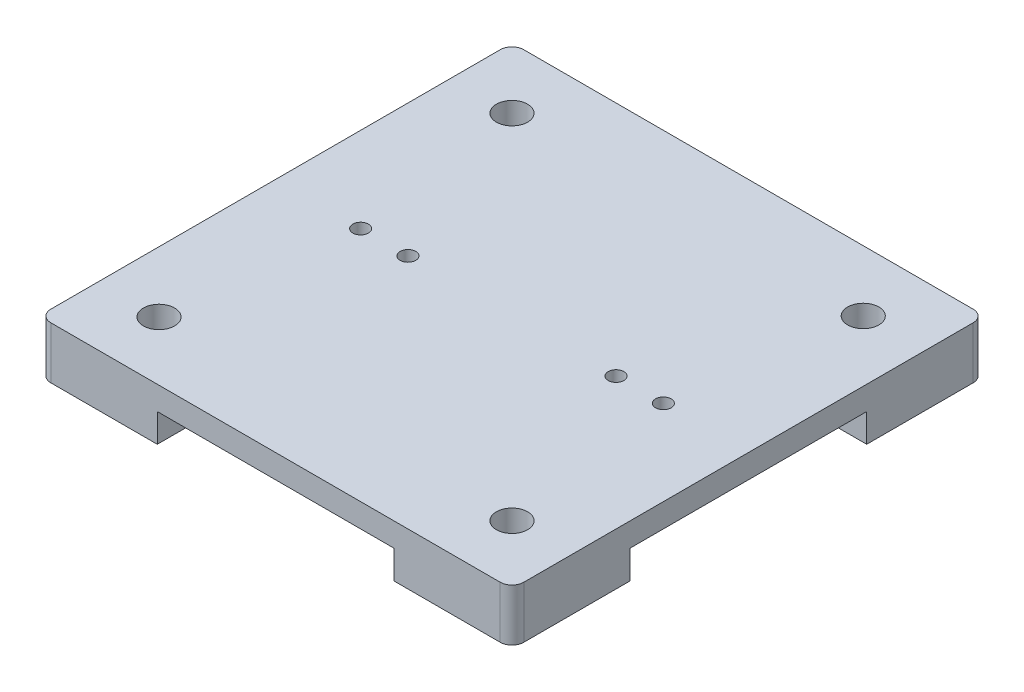
ISO-10303-21;
HEADER;
FILE_DESCRIPTION(('STEP AP214'),'2;1');
FILE_NAME('part.step','',(''),(''),'','','');
FILE_SCHEMA(('AUTOMOTIVE_DESIGN { 1 0 10303 214 1 1 1 1 }'));
ENDSEC;
DATA;
#1=APPLICATION_CONTEXT('core data for automotive mechanical design processes');
#2=APPLICATION_PROTOCOL_DEFINITION('international standard','automotive_design',2000,#1);
#3=PRODUCT_CONTEXT('',#1,'mechanical');
#4=PRODUCT('Part','Part','',(#3));
#5=PRODUCT_RELATED_PRODUCT_CATEGORY('part','',(#4));
#6=PRODUCT_DEFINITION_FORMATION('','',#4);
#7=PRODUCT_DEFINITION_CONTEXT('part definition',#1,'design');
#8=PRODUCT_DEFINITION('design','',#6,#7);
#9=PRODUCT_DEFINITION_SHAPE('','',#8);
#10=(LENGTH_UNIT() NAMED_UNIT(*) SI_UNIT(.MILLI.,.METRE.));
#11=(NAMED_UNIT(*) PLANE_ANGLE_UNIT() SI_UNIT($,.RADIAN.));
#12=(NAMED_UNIT(*) SI_UNIT($,.STERADIAN.) SOLID_ANGLE_UNIT());
#13=UNCERTAINTY_MEASURE_WITH_UNIT(LENGTH_MEASURE(1.E-05),#10,'distance_accuracy_value','');
#14=(GEOMETRIC_REPRESENTATION_CONTEXT(3) GLOBAL_UNCERTAINTY_ASSIGNED_CONTEXT((#13)) GLOBAL_UNIT_ASSIGNED_CONTEXT((#10,
#11,#12)) REPRESENTATION_CONTEXT('',''));
#15=CARTESIAN_POINT('',(0.,0.,0.));
#16=DIRECTION('',(0.,0.,1.));
#17=DIRECTION('',(1.,0.,0.));
#18=AXIS2_PLACEMENT_3D('',#15,#16,#17);
#19=CARTESIAN_POINT('',(-47.5,-6.00000000000001,47.5000000000001));
#20=DIRECTION('',(0.,-1.,0.));
#21=DIRECTION('',(0.,0.,-1.));
#22=AXIS2_PLACEMENT_3D('',#19,#20,#21);
#23=PLANE('',#22);
#24=CARTESIAN_POINT('',(-47.5,-6.00000000000001,47.5000000000001));
#25=DIRECTION('',(0.,-1.,0.));
#26=DIRECTION('',(0.,0.,-1.));
#27=AXIS2_PLACEMENT_3D('',#24,#25,#26);
#28=CIRCLE('',#27,2.5);
#29=CARTESIAN_POINT('',(-47.5,-6.00000000000001,50.));
#30=VERTEX_POINT('',#29);
#31=CARTESIAN_POINT('',(-50.,-6.00000000000001,47.4999999999999));
#32=VERTEX_POINT('',#31);
#33=EDGE_CURVE('E268',#30,#32,#28,.T.);
#34=ORIENTED_EDGE('',*,*,#33,.T.);
#35=DIRECTION('',(0.,0.,-1.));
#36=VECTOR('',#35,1.);
#37=CARTESIAN_POINT('',(-50.,-5.99999999999978,24.9999999999999));
#38=LINE('',#37,#36);
#39=CARTESIAN_POINT('',(-50.,-5.99999999999978,24.9999999999999));
#40=VERTEX_POINT('',#39);
#41=EDGE_CURVE('E271',#32,#40,#38,.T.);
#42=ORIENTED_EDGE('',*,*,#41,.T.);
#43=DIRECTION('',(1.,0.,0.));
#44=VECTOR('',#43,1.);
#45=CARTESIAN_POINT('',(-25.,-5.99999999999978,24.9999999999999));
#46=LINE('',#45,#44);
#47=CARTESIAN_POINT('',(-25.,-5.99999999999978,24.9999999999999));
#48=VERTEX_POINT('',#47);
#49=EDGE_CURVE('E274',#40,#48,#46,.T.);
#50=ORIENTED_EDGE('',*,*,#49,.T.);
#51=DIRECTION('',(0.,0.,1.));
#52=VECTOR('',#51,1.);
#53=CARTESIAN_POINT('',(-25.,-5.99999999999978,24.9999999999999));
#54=LINE('',#53,#52);
#55=CARTESIAN_POINT('',(-25.0000000000001,-5.99999999999989,50.0000000000003));
#56=VERTEX_POINT('',#55);
#57=EDGE_CURVE('E276',#48,#56,#54,.T.);
#58=ORIENTED_EDGE('',*,*,#57,.T.);
#59=DIRECTION('',(-1.,0.,0.));
#60=VECTOR('',#59,1.);
#61=CARTESIAN_POINT('',(-25.0000000000001,-5.99999999999989,50.0000000000003));
#62=LINE('',#61,#60);
#63=EDGE_CURVE('E278',#56,#30,#62,.T.);
#64=ORIENTED_EDGE('',*,*,#63,.T.);
#65=EDGE_LOOP('',(#34,#42,#50,#58,#64));
#66=FACE_BOUND('',#65,.T.);
#67=CARTESIAN_POINT('',(-37.1338834764834,-5.99999999999978,37.5000000000001));
#68=DIRECTION('',(0.,1.,0.));
#69=DIRECTION('',(0.,0.,1.));
#70=AXIS2_PLACEMENT_3D('',#67,#68,#69);
#71=CIRCLE('',#70,3.29999999999999);
#72=CARTESIAN_POINT('',(-37.1338834764834,-5.99999999999978,40.8000000000001));
#73=VERTEX_POINT('',#72);
#74=EDGE_CURVE('E657',#73,#73,#71,.T.);
#75=ORIENTED_EDGE('',*,*,#74,.T.);
#76=EDGE_LOOP('',(#75));
#77=FACE_BOUND('',#76,.T.);
#78=ADVANCED_FACE('F41',(#66,#77),#23,.T.);
#79=CARTESIAN_POINT('',(-47.5,0.,47.5000000000001));
#80=DIRECTION('',(0.,1.,0.));
#81=DIRECTION('',(0.,0.,1.));
#82=AXIS2_PLACEMENT_3D('',#79,#80,#81);
#83=PLANE('',#82);
#84=CARTESIAN_POINT('',(-32.,0.,0.));
#85=DIRECTION('',(0.,1.,0.));
#86=DIRECTION('',(0.,0.,1.));
#87=AXIS2_PLACEMENT_3D('',#84,#85,#86);
#88=CIRCLE('',#87,1.65);
#89=CARTESIAN_POINT('',(-32.,0.,1.65));
#90=VERTEX_POINT('',#89);
#91=EDGE_CURVE('E669',#90,#90,#88,.T.);
#92=ORIENTED_EDGE('',*,*,#91,.T.);
#93=EDGE_LOOP('',(#92));
#94=FACE_BOUND('',#93,.T.);
#95=CARTESIAN_POINT('',(-22.,1.11022302462516E-13,0.));
#96=DIRECTION('',(0.,1.,0.));
#97=DIRECTION('',(0.,0.,1.));
#98=AXIS2_PLACEMENT_3D('',#95,#96,#97);
#99=CIRCLE('',#98,1.65);
#100=CARTESIAN_POINT('',(-22.,1.11022302462516E-13,1.65));
#101=VERTEX_POINT('',#100);
#102=EDGE_CURVE('E672',#101,#101,#99,.T.);
#103=ORIENTED_EDGE('',*,*,#102,.T.);
#104=EDGE_LOOP('',(#103));
#105=FACE_BOUND('',#104,.T.);
#106=CARTESIAN_POINT('',(22.,0.,0.));
#107=DIRECTION('',(0.,1.,0.));
#108=DIRECTION('',(0.,0.,1.));
#109=AXIS2_PLACEMENT_3D('',#106,#107,#108);
#110=CIRCLE('',#109,1.65);
#111=CARTESIAN_POINT('',(22.,0.,1.65));
#112=VERTEX_POINT('',#111);
#113=EDGE_CURVE('E678',#112,#112,#110,.T.);
#114=ORIENTED_EDGE('',*,*,#113,.T.);
#115=EDGE_LOOP('',(#114));
#116=FACE_BOUND('',#115,.T.);
#117=CARTESIAN_POINT('',(32.,0.,0.));
#118=DIRECTION('',(0.,1.,0.));
#119=DIRECTION('',(0.,0.,1.));
#120=AXIS2_PLACEMENT_3D('',#117,#118,#119);
#121=CIRCLE('',#120,1.65);
#122=CARTESIAN_POINT('',(32.,0.,1.65));
#123=VERTEX_POINT('',#122);
#124=EDGE_CURVE('E684',#123,#123,#121,.T.);
#125=ORIENTED_EDGE('',*,*,#124,.T.);
#126=EDGE_LOOP('',(#125));
#127=FACE_BOUND('',#126,.T.);
#128=DIRECTION('',(1.,0.,0.));
#129=VECTOR('',#128,1.);
#130=CARTESIAN_POINT('',(25.,1.11022302462516E-13,24.9999999999999));
#131=LINE('',#130,#129);
#132=CARTESIAN_POINT('',(25.,1.11022302462516E-13,24.9999999999999));
#133=VERTEX_POINT('',#132);
#134=CARTESIAN_POINT('',(50.,2.22044604925031E-13,24.9999999999999));
#135=VERTEX_POINT('',#134);
#136=EDGE_CURVE('E253',#133,#135,#131,.T.);
#137=ORIENTED_EDGE('',*,*,#136,.F.);
#138=DIRECTION('',(0.,0.,-1.));
#139=VECTOR('',#138,1.);
#140=CARTESIAN_POINT('',(25.,1.11022302462516E-13,24.9999999999999));
#141=LINE('',#140,#139);
#142=CARTESIAN_POINT('',(25.,0.,50.0000000000003));
#143=VERTEX_POINT('',#142);
#144=EDGE_CURVE('E56',#143,#133,#141,.T.);
#145=ORIENTED_EDGE('',*,*,#144,.F.);
#146=DIRECTION('',(1.,0.,0.));
#147=VECTOR('',#146,1.);
#148=CARTESIAN_POINT('',(-47.5,0.,50.));
#149=LINE('',#148,#147);
#150=CARTESIAN_POINT('',(-25.,1.11022302462516E-13,50.0000000000003));
#151=VERTEX_POINT('',#150);
#152=EDGE_CURVE('E60',#151,#143,#149,.T.);
#153=ORIENTED_EDGE('',*,*,#152,.F.);
#154=DIRECTION('',(0.,0.,1.));
#155=VECTOR('',#154,1.);
#156=CARTESIAN_POINT('',(-25.,2.22044604925031E-13,24.9999999999999));
#157=LINE('',#156,#155);
#158=CARTESIAN_POINT('',(-25.,2.22044604925031E-13,24.9999999999999));
#159=VERTEX_POINT('',#158);
#160=EDGE_CURVE('E272',#159,#151,#157,.T.);
#161=ORIENTED_EDGE('',*,*,#160,.F.);
#162=DIRECTION('',(1.,0.,0.));
#163=VECTOR('',#162,1.);
#164=CARTESIAN_POINT('',(-25.,2.22044604925031E-13,24.9999999999999));
#165=LINE('',#164,#163);
#166=CARTESIAN_POINT('',(-50.,2.22044604925031E-13,24.9999999999999));
#167=VERTEX_POINT('',#166);
#168=EDGE_CURVE('E195',#167,#159,#165,.T.);
#169=ORIENTED_EDGE('',*,*,#168,.F.);
#170=DIRECTION('',(0.,0.,1.));
#171=VECTOR('',#170,1.);
#172=CARTESIAN_POINT('',(-50.,0.,-47.5000000000001));
#173=LINE('',#172,#171);
#174=CARTESIAN_POINT('',(-49.9999999999998,0.,-24.9999999999999));
#175=VERTEX_POINT('',#174);
#176=EDGE_CURVE('E179',#175,#167,#173,.T.);
#177=ORIENTED_EDGE('',*,*,#176,.F.);
#178=DIRECTION('',(-1.,0.,0.));
#179=VECTOR('',#178,1.);
#180=CARTESIAN_POINT('',(-24.9999999999997,0.,-24.9999999999999));
#181=LINE('',#180,#179);
#182=CARTESIAN_POINT('',(-24.9999999999997,0.,-24.9999999999999));
#183=VERTEX_POINT('',#182);
#184=EDGE_CURVE('E173',#183,#175,#181,.T.);
#185=ORIENTED_EDGE('',*,*,#184,.F.);
#186=DIRECTION('',(0.,0.,1.));
#187=VECTOR('',#186,1.);
#188=CARTESIAN_POINT('',(-24.9999999999997,0.,-24.9999999999999));
#189=LINE('',#188,#187);
#190=CARTESIAN_POINT('',(-25.,2.22044604925031E-13,-50.));
#191=VERTEX_POINT('',#190);
#192=EDGE_CURVE('E176',#191,#183,#189,.T.);
#193=ORIENTED_EDGE('',*,*,#192,.F.);
#194=DIRECTION('',(1.,0.,0.));
#195=VECTOR('',#194,1.);
#196=CARTESIAN_POINT('',(-47.5,2.22044604925031E-13,-50.));
#197=LINE('',#196,#195);
#198=CARTESIAN_POINT('',(25.,1.11022302462516E-13,-50.));
#199=VERTEX_POINT('',#198);
#200=EDGE_CURVE('E297',#191,#199,#197,.T.);
#201=ORIENTED_EDGE('',*,*,#200,.T.);
#202=DIRECTION('',(0.,0.,-1.));
#203=VECTOR('',#202,1.);
#204=CARTESIAN_POINT('',(25.0000000000002,0.,-24.9999999999999));
#205=LINE('',#204,#203);
#206=CARTESIAN_POINT('',(25.0000000000002,0.,-24.9999999999999));
#207=VERTEX_POINT('',#206);
#208=EDGE_CURVE('E226',#207,#199,#205,.T.);
#209=ORIENTED_EDGE('',*,*,#208,.F.);
#210=DIRECTION('',(-1.,0.,0.));
#211=VECTOR('',#210,1.);
#212=CARTESIAN_POINT('',(25.0000000000002,0.,-24.9999999999999));
#213=LINE('',#212,#211);
#214=CARTESIAN_POINT('',(50.0000000000002,0.,-24.9999999999999));
#215=VERTEX_POINT('',#214);
#216=EDGE_CURVE('E203',#215,#207,#213,.T.);
#217=ORIENTED_EDGE('',*,*,#216,.F.);
#218=DIRECTION('',(0.,0.,1.));
#219=VECTOR('',#218,1.);
#220=CARTESIAN_POINT('',(50.,0.,-47.5000000000001));
#221=LINE('',#220,#219);
#222=EDGE_CURVE('E317',#215,#135,#221,.T.);
#223=ORIENTED_EDGE('',*,*,#222,.T.);
#224=EDGE_LOOP('',(#137,#145,#153,#161,#169,#177,#185,#193,#201,#209,#217,#223));
#225=FACE_BOUND('',#224,.T.);
#226=ADVANCED_FACE('F175',(#94,#105,#116,#127,#225),#83,.F.);
#227=CARTESIAN_POINT('',(-50.,5.,-47.5000000000001));
#228=DIRECTION('',(1.,0.,0.));
#229=DIRECTION('',(0.,0.,-1.));
#230=AXIS2_PLACEMENT_3D('',#227,#228,#229);
#231=PLANE('',#230);
#232=DIRECTION('',(0.,-1.,0.));
#233=VECTOR('',#232,1.);
#234=CARTESIAN_POINT('',(-50.,5.,-47.5000000000001));
#235=LINE('',#234,#233);
#236=CARTESIAN_POINT('',(-50.,5.,-47.5000000000001));
#237=VERTEX_POINT('',#236);
#238=CARTESIAN_POINT('',(-50.,-6.00000000000001,-47.5000000000001));
#239=VERTEX_POINT('',#238);
#240=EDGE_CURVE('E314',#237,#239,#235,.T.);
#241=ORIENTED_EDGE('',*,*,#240,.T.);
#242=DIRECTION('',(0.,0.,-1.));
#243=VECTOR('',#242,1.);
#244=CARTESIAN_POINT('',(-50.,-6.00000000000001,-24.9999999999999));
#245=LINE('',#244,#243);
#246=CARTESIAN_POINT('',(-50.,-6.00000000000001,-24.9999999999999));
#247=VERTEX_POINT('',#246);
#248=EDGE_CURVE('E201',#247,#239,#245,.T.);
#249=ORIENTED_EDGE('',*,*,#248,.F.);
#250=DIRECTION('',(0.,1.,0.));
#251=VECTOR('',#250,1.);
#252=CARTESIAN_POINT('',(-50.,-6.00000000000001,-24.9999999999999));
#253=LINE('',#252,#251);
#254=EDGE_CURVE('E199',#247,#175,#253,.T.);
#255=ORIENTED_EDGE('',*,*,#254,.T.);
#256=ORIENTED_EDGE('',*,*,#176,.T.);
#257=DIRECTION('',(0.,1.,0.));
#258=VECTOR('',#257,1.);
#259=CARTESIAN_POINT('',(-50.,-5.99999999999978,24.9999999999999));
#260=LINE('',#259,#258);
#261=EDGE_CURVE('E290',#40,#167,#260,.T.);
#262=ORIENTED_EDGE('',*,*,#261,.F.);
#263=ORIENTED_EDGE('',*,*,#41,.F.);
#264=DIRECTION('',(0.,-1.,0.));
#265=VECTOR('',#264,1.);
#266=CARTESIAN_POINT('',(-50.,5.,47.4999999999999));
#267=LINE('',#266,#265);
#268=CARTESIAN_POINT('',(-50.,5.,47.4999999999999));
#269=VERTEX_POINT('',#268);
#270=EDGE_CURVE('E11',#269,#32,#267,.T.);
#271=ORIENTED_EDGE('',*,*,#270,.F.);
#272=DIRECTION('',(0.,0.,1.));
#273=VECTOR('',#272,1.);
#274=CARTESIAN_POINT('',(-50.,5.,-47.5000000000001));
#275=LINE('',#274,#273);
#276=EDGE_CURVE('E293',#237,#269,#275,.T.);
#277=ORIENTED_EDGE('',*,*,#276,.F.);
#278=EDGE_LOOP('',(#241,#249,#255,#256,#262,#263,#271,#277));
#279=FACE_BOUND('',#278,.T.);
#280=ADVANCED_FACE('F43',(#279),#231,.F.);
#281=CARTESIAN_POINT('',(-47.4999999999999,5.,47.5000000000001));
#282=DIRECTION('',(0.,-1.,0.));
#283=DIRECTION('',(0.,0.,-1.));
#284=AXIS2_PLACEMENT_3D('',#281,#282,#283);
#285=CYLINDRICAL_SURFACE('',#284,2.5);
#286=ORIENTED_EDGE('',*,*,#270,.T.);
#287=ORIENTED_EDGE('',*,*,#33,.F.);
#288=DIRECTION('',(0.,-1.,0.));
#289=VECTOR('',#288,1.);
#290=CARTESIAN_POINT('',(-47.5,5.,50.));
#291=LINE('',#290,#289);
#292=CARTESIAN_POINT('',(-47.5,5.,50.));
#293=VERTEX_POINT('',#292);
#294=EDGE_CURVE('E49',#293,#30,#291,.T.);
#295=ORIENTED_EDGE('',*,*,#294,.F.);
#296=CARTESIAN_POINT('',(-47.4999999999999,5.,47.5000000000001));
#297=DIRECTION('',(0.,1.,0.));
#298=DIRECTION('',(0.,0.,1.));
#299=AXIS2_PLACEMENT_3D('',#296,#297,#298);
#300=CIRCLE('',#299,2.5);
#301=EDGE_CURVE('E296',#269,#293,#300,.T.);
#302=ORIENTED_EDGE('',*,*,#301,.F.);
#303=EDGE_LOOP('',(#286,#287,#295,#302));
#304=FACE_BOUND('',#303,.T.);
#305=ADVANCED_FACE('F342',(#304),#285,.T.);
#306=CARTESIAN_POINT('',(-47.5,5.,50.));
#307=DIRECTION('',(0.,0.,-1.));
#308=DIRECTION('',(-1.,0.,0.));
#309=AXIS2_PLACEMENT_3D('',#306,#307,#308);
#310=PLANE('',#309);
#311=ORIENTED_EDGE('',*,*,#294,.T.);
#312=ORIENTED_EDGE('',*,*,#63,.F.);
#313=DIRECTION('',(0.,1.,0.));
#314=VECTOR('',#313,1.);
#315=CARTESIAN_POINT('',(-25.0000000000001,-5.99999999999989,50.0000000000003));
#316=LINE('',#315,#314);
#317=EDGE_CURVE('E281',#56,#151,#316,.T.);
#318=ORIENTED_EDGE('',*,*,#317,.T.);
#319=ORIENTED_EDGE('',*,*,#152,.T.);
#320=DIRECTION('',(0.,1.,0.));
#321=VECTOR('',#320,1.);
#322=CARTESIAN_POINT('',(25.,-6.00000000000001,50.0000000000003));
#323=LINE('',#322,#321);
#324=CARTESIAN_POINT('',(25.,-6.00000000000001,50.0000000000003));
#325=VERTEX_POINT('',#324);
#326=EDGE_CURVE('E242',#325,#143,#323,.T.);
#327=ORIENTED_EDGE('',*,*,#326,.F.);
#328=DIRECTION('',(-1.,0.,0.));
#329=VECTOR('',#328,1.);
#330=CARTESIAN_POINT('',(25.,-6.00000000000001,50.0000000000003));
#331=LINE('',#330,#329);
#332=CARTESIAN_POINT('',(47.4999999999999,-6.00000000000001,50.0000000000003));
#333=VERTEX_POINT('',#332);
#334=EDGE_CURVE('E264',#333,#325,#331,.T.);
#335=ORIENTED_EDGE('',*,*,#334,.F.);
#336=DIRECTION('',(0.,-1.,0.));
#337=VECTOR('',#336,1.);
#338=CARTESIAN_POINT('',(47.5,5.,50.0000000000003));
#339=LINE('',#338,#337);
#340=CARTESIAN_POINT('',(47.5,5.,50.0000000000003));
#341=VERTEX_POINT('',#340);
#342=EDGE_CURVE('E329',#341,#333,#339,.T.);
#343=ORIENTED_EDGE('',*,*,#342,.F.);
#344=DIRECTION('',(1.,0.,0.));
#345=VECTOR('',#344,1.);
#346=CARTESIAN_POINT('',(-47.5,5.,50.));
#347=LINE('',#346,#345);
#348=EDGE_CURVE('E299',#293,#341,#347,.T.);
#349=ORIENTED_EDGE('',*,*,#348,.F.);
#350=EDGE_LOOP('',(#311,#312,#318,#319,#327,#335,#343,#349));
#351=FACE_BOUND('',#350,.T.);
#352=ADVANCED_FACE('F334',(#351),#310,.F.);
#353=CARTESIAN_POINT('',(47.5,5.,47.5000000000003));
#354=DIRECTION('',(0.,-1.,0.));
#355=DIRECTION('',(0.,0.,-1.));
#356=AXIS2_PLACEMENT_3D('',#353,#354,#355);
#357=CYLINDRICAL_SURFACE('',#356,2.5);
#358=ORIENTED_EDGE('',*,*,#342,.T.);
#359=CARTESIAN_POINT('',(47.5,-6.00000000000001,47.5000000000003));
#360=DIRECTION('',(0.,-1.,0.));
#361=DIRECTION('',(0.,0.,-1.));
#362=AXIS2_PLACEMENT_3D('',#359,#360,#361);
#363=CIRCLE('',#362,2.5);
#364=CARTESIAN_POINT('',(50.,-5.99999999999989,47.4999999999999));
#365=VERTEX_POINT('',#364);
#366=EDGE_CURVE('E256',#365,#333,#363,.T.);
#367=ORIENTED_EDGE('',*,*,#366,.F.);
#368=DIRECTION('',(0.,-1.,0.));
#369=VECTOR('',#368,1.);
#370=CARTESIAN_POINT('',(50.,5.,47.4999999999999));
#371=LINE('',#370,#369);
#372=CARTESIAN_POINT('',(50.,5.,47.4999999999999));
#373=VERTEX_POINT('',#372);
#374=EDGE_CURVE('E327',#373,#365,#371,.T.);
#375=ORIENTED_EDGE('',*,*,#374,.F.);
#376=CARTESIAN_POINT('',(47.5,5.,47.5000000000003));
#377=DIRECTION('',(0.,1.,0.));
#378=DIRECTION('',(0.,0.,1.));
#379=AXIS2_PLACEMENT_3D('',#376,#377,#378);
#380=CIRCLE('',#379,2.5);
#381=EDGE_CURVE('E301',#341,#373,#380,.T.);
#382=ORIENTED_EDGE('',*,*,#381,.F.);
#383=EDGE_LOOP('',(#358,#367,#375,#382));
#384=FACE_BOUND('',#383,.T.);
#385=ADVANCED_FACE('F368',(#384),#357,.T.);
#386=CARTESIAN_POINT('',(50.,5.,-47.5000000000001));
#387=DIRECTION('',(1.,0.,0.));
#388=DIRECTION('',(0.,0.,-1.));
#389=AXIS2_PLACEMENT_3D('',#386,#387,#388);
#390=PLANE('',#389);
#391=ORIENTED_EDGE('',*,*,#222,.F.);
#392=DIRECTION('',(0.,1.,0.));
#393=VECTOR('',#392,1.);
#394=CARTESIAN_POINT('',(50.,-6.00000000000001,-24.9999999999999));
#395=LINE('',#394,#393);
#396=CARTESIAN_POINT('',(50.,-6.00000000000001,-24.9999999999999));
#397=VERTEX_POINT('',#396);
#398=EDGE_CURVE('E216',#397,#215,#395,.T.);
#399=ORIENTED_EDGE('',*,*,#398,.F.);
#400=DIRECTION('',(0.,0.,1.));
#401=VECTOR('',#400,1.);
#402=CARTESIAN_POINT('',(50.,-6.00000000000001,-24.9999999999999));
#403=LINE('',#402,#401);
#404=CARTESIAN_POINT('',(50.,-6.00000000000001,-47.5000000000001));
#405=VERTEX_POINT('',#404);
#406=EDGE_CURVE('E238',#405,#397,#403,.T.);
#407=ORIENTED_EDGE('',*,*,#406,.F.);
#408=DIRECTION('',(0.,-1.,0.));
#409=VECTOR('',#408,1.);
#410=CARTESIAN_POINT('',(50.,5.,-47.5000000000001));
#411=LINE('',#410,#409);
#412=CARTESIAN_POINT('',(50.,5.,-47.5000000000001));
#413=VERTEX_POINT('',#412);
#414=EDGE_CURVE('E325',#413,#405,#411,.T.);
#415=ORIENTED_EDGE('',*,*,#414,.F.);
#416=DIRECTION('',(0.,0.,1.));
#417=VECTOR('',#416,1.);
#418=CARTESIAN_POINT('',(50.,5.,-47.5000000000001));
#419=LINE('',#418,#417);
#420=EDGE_CURVE('E303',#413,#373,#419,.T.);
#421=ORIENTED_EDGE('',*,*,#420,.T.);
#422=ORIENTED_EDGE('',*,*,#374,.T.);
#423=DIRECTION('',(0.,0.,1.));
#424=VECTOR('',#423,1.);
#425=CARTESIAN_POINT('',(50.,-5.99999999999978,24.9999999999999));
#426=LINE('',#425,#424);
#427=CARTESIAN_POINT('',(50.,-5.99999999999978,24.9999999999999));
#428=VERTEX_POINT('',#427);
#429=EDGE_CURVE('E252',#428,#365,#426,.T.);
#430=ORIENTED_EDGE('',*,*,#429,.F.);
#431=DIRECTION('',(0.,1.,0.));
#432=VECTOR('',#431,1.);
#433=CARTESIAN_POINT('',(50.,-5.99999999999978,24.9999999999999));
#434=LINE('',#433,#432);
#435=EDGE_CURVE('E249',#428,#135,#434,.T.);
#436=ORIENTED_EDGE('',*,*,#435,.T.);
#437=EDGE_LOOP('',(#391,#399,#407,#415,#421,#422,#430,#436));
#438=FACE_BOUND('',#437,.T.);
#439=ADVANCED_FACE('F395',(#438),#390,.T.);
#440=CARTESIAN_POINT('',(47.5,5.,-47.5000000000001));
#441=DIRECTION('',(0.,-1.,0.));
#442=DIRECTION('',(0.,0.,-1.));
#443=AXIS2_PLACEMENT_3D('',#440,#441,#442);
#444=CYLINDRICAL_SURFACE('',#443,2.5);
#445=ORIENTED_EDGE('',*,*,#414,.T.);
#446=CARTESIAN_POINT('',(47.4999999999999,-5.99999999999989,-47.5000000000001));
#447=DIRECTION('',(0.,-1.,0.));
#448=DIRECTION('',(0.,0.,-1.));
#449=AXIS2_PLACEMENT_3D('',#446,#447,#448);
#450=CIRCLE('',#449,2.5);
#451=CARTESIAN_POINT('',(47.5,-5.99999999999978,-50.));
#452=VERTEX_POINT('',#451);
#453=EDGE_CURVE('E229',#452,#405,#450,.T.);
#454=ORIENTED_EDGE('',*,*,#453,.F.);
#455=DIRECTION('',(0.,-1.,0.));
#456=VECTOR('',#455,1.);
#457=CARTESIAN_POINT('',(47.5,5.00000000000012,-50.));
#458=LINE('',#457,#456);
#459=CARTESIAN_POINT('',(47.5,5.00000000000012,-50.));
#460=VERTEX_POINT('',#459);
#461=EDGE_CURVE('E323',#460,#452,#458,.T.);
#462=ORIENTED_EDGE('',*,*,#461,.F.);
#463=CARTESIAN_POINT('',(47.5,5.,-47.5000000000001));
#464=DIRECTION('',(0.,1.,0.));
#465=DIRECTION('',(0.,0.,1.));
#466=AXIS2_PLACEMENT_3D('',#463,#464,#465);
#467=CIRCLE('',#466,2.5);
#468=EDGE_CURVE('E306',#413,#460,#467,.T.);
#469=ORIENTED_EDGE('',*,*,#468,.F.);
#470=EDGE_LOOP('',(#445,#454,#462,#469));
#471=FACE_BOUND('',#470,.T.);
#472=ADVANCED_FACE('F433',(#471),#444,.T.);
#473=CARTESIAN_POINT('',(-47.4999999999999,5.00000000000012,-50.));
#474=DIRECTION('',(0.,0.,-1.));
#475=DIRECTION('',(-1.,0.,0.));
#476=AXIS2_PLACEMENT_3D('',#473,#474,#475);
#477=PLANE('',#476);
#478=ORIENTED_EDGE('',*,*,#200,.F.);
#479=DIRECTION('',(0.,1.,0.));
#480=VECTOR('',#479,1.);
#481=CARTESIAN_POINT('',(-25.,-5.99999999999978,-50.));
#482=LINE('',#481,#480);
#483=CARTESIAN_POINT('',(-25.,-5.99999999999978,-50.));
#484=VERTEX_POINT('',#483);
#485=EDGE_CURVE('E194',#484,#191,#482,.T.);
#486=ORIENTED_EDGE('',*,*,#485,.F.);
#487=DIRECTION('',(1.,0.,0.));
#488=VECTOR('',#487,1.);
#489=CARTESIAN_POINT('',(-25.,-5.99999999999978,-50.));
#490=LINE('',#489,#488);
#491=CARTESIAN_POINT('',(-47.5,-5.99999999999989,-50.));
#492=VERTEX_POINT('',#491);
#493=EDGE_CURVE('E212',#492,#484,#490,.T.);
#494=ORIENTED_EDGE('',*,*,#493,.F.);
#495=DIRECTION('',(0.,-1.,0.));
#496=VECTOR('',#495,1.);
#497=CARTESIAN_POINT('',(-47.4999999999999,5.00000000000012,-50.));
#498=LINE('',#497,#496);
#499=CARTESIAN_POINT('',(-47.4999999999999,5.00000000000012,-50.));
#500=VERTEX_POINT('',#499);
#501=EDGE_CURVE('E321',#500,#492,#498,.T.);
#502=ORIENTED_EDGE('',*,*,#501,.F.);
#503=DIRECTION('',(1.,0.,0.));
#504=VECTOR('',#503,1.);
#505=CARTESIAN_POINT('',(-47.4999999999999,5.00000000000012,-50.));
#506=LINE('',#505,#504);
#507=EDGE_CURVE('E308',#500,#460,#506,.T.);
#508=ORIENTED_EDGE('',*,*,#507,.T.);
#509=ORIENTED_EDGE('',*,*,#461,.T.);
#510=DIRECTION('',(1.,0.,0.));
#511=VECTOR('',#510,1.);
#512=CARTESIAN_POINT('',(25.,-5.99999999999989,-50.));
#513=LINE('',#512,#511);
#514=CARTESIAN_POINT('',(25.,-5.99999999999989,-50.));
#515=VERTEX_POINT('',#514);
#516=EDGE_CURVE('E225',#515,#452,#513,.T.);
#517=ORIENTED_EDGE('',*,*,#516,.F.);
#518=DIRECTION('',(0.,1.,0.));
#519=VECTOR('',#518,1.);
#520=CARTESIAN_POINT('',(25.,-5.99999999999989,-50.));
#521=LINE('',#520,#519);
#522=EDGE_CURVE('E222',#515,#199,#521,.T.);
#523=ORIENTED_EDGE('',*,*,#522,.T.);
#524=EDGE_LOOP('',(#478,#486,#494,#502,#508,#509,#517,#523));
#525=FACE_BOUND('',#524,.T.);
#526=ADVANCED_FACE('F382',(#525),#477,.T.);
#527=CARTESIAN_POINT('',(-47.5,5.,-47.5000000000001));
#528=DIRECTION('',(0.,-1.,0.));
#529=DIRECTION('',(0.,0.,-1.));
#530=AXIS2_PLACEMENT_3D('',#527,#528,#529);
#531=CYLINDRICAL_SURFACE('',#530,2.5);
#532=ORIENTED_EDGE('',*,*,#501,.T.);
#533=CARTESIAN_POINT('',(-47.5,-6.00000000000001,-47.5000000000001));
#534=DIRECTION('',(0.,-1.,0.));
#535=DIRECTION('',(0.,0.,-1.));
#536=AXIS2_PLACEMENT_3D('',#533,#534,#535);
#537=CIRCLE('',#536,2.5);
#538=EDGE_CURVE('E184',#239,#492,#537,.T.);
#539=ORIENTED_EDGE('',*,*,#538,.F.);
#540=ORIENTED_EDGE('',*,*,#240,.F.);
#541=CARTESIAN_POINT('',(-47.5,5.,-47.5000000000001));
#542=DIRECTION('',(0.,-1.,0.));
#543=DIRECTION('',(0.,0.,-1.));
#544=AXIS2_PLACEMENT_3D('',#541,#542,#543);
#545=CIRCLE('',#544,2.5);
#546=EDGE_CURVE('E311',#237,#500,#545,.T.);
#547=ORIENTED_EDGE('',*,*,#546,.T.);
#548=EDGE_LOOP('',(#532,#539,#540,#547));
#549=FACE_BOUND('',#548,.T.);
#550=ADVANCED_FACE('F379',(#549),#531,.T.);
#551=CARTESIAN_POINT('',(-47.4999999999999,5.,47.5000000000001));
#552=DIRECTION('',(0.,1.,0.));
#553=DIRECTION('',(0.,0.,1.));
#554=AXIS2_PLACEMENT_3D('',#551,#552,#553);
#555=PLANE('',#554);
#556=CARTESIAN_POINT('',(-37.1338834764828,5.,-37.1338834764832));
#557=DIRECTION('',(0.,1.,0.));
#558=DIRECTION('',(0.,0.,1.));
#559=AXIS2_PLACEMENT_3D('',#556,#557,#558);
#560=CIRCLE('',#559,3.29999999999999);
#561=CARTESIAN_POINT('',(-37.1338834764828,5.,-33.8338834764832));
#562=VERTEX_POINT('',#561);
#563=EDGE_CURVE('E644',#562,#562,#560,.T.);
#564=ORIENTED_EDGE('',*,*,#563,.F.);
#565=EDGE_LOOP('',(#564));
#566=FACE_BOUND('',#565,.T.);
#567=CARTESIAN_POINT('',(37.5000000000002,5.00000000000012,37.5000000000001));
#568=DIRECTION('',(0.,1.,0.));
#569=DIRECTION('',(0.,0.,1.));
#570=AXIS2_PLACEMENT_3D('',#567,#568,#569);
#571=CIRCLE('',#570,3.29999999999999);
#572=CARTESIAN_POINT('',(37.5000000000002,5.00000000000012,40.8000000000001));
#573=VERTEX_POINT('',#572);
#574=EDGE_CURVE('E646',#573,#573,#571,.T.);
#575=ORIENTED_EDGE('',*,*,#574,.F.);
#576=EDGE_LOOP('',(#575));
#577=FACE_BOUND('',#576,.T.);
#578=CARTESIAN_POINT('',(-37.133883476483,5.00000000000012,37.5000000000001));
#579=DIRECTION('',(0.,1.,0.));
#580=DIRECTION('',(0.,0.,1.));
#581=AXIS2_PLACEMENT_3D('',#578,#579,#580);
#582=CIRCLE('',#581,3.29999999999999);
#583=CARTESIAN_POINT('',(-37.133883476483,5.00000000000012,40.8000000000001));
#584=VERTEX_POINT('',#583);
#585=EDGE_CURVE('E654',#584,#584,#582,.T.);
#586=ORIENTED_EDGE('',*,*,#585,.F.);
#587=EDGE_LOOP('',(#586));
#588=FACE_BOUND('',#587,.T.);
#589=CARTESIAN_POINT('',(37.1338834764836,5.,-37.1338834764832));
#590=DIRECTION('',(0.,1.,0.));
#591=DIRECTION('',(0.,0.,1.));
#592=AXIS2_PLACEMENT_3D('',#589,#590,#591);
#593=CIRCLE('',#592,3.29999999999998);
#594=CARTESIAN_POINT('',(37.1338834764836,5.,-33.8338834764832));
#595=VERTEX_POINT('',#594);
#596=EDGE_CURVE('E660',#595,#595,#593,.T.);
#597=ORIENTED_EDGE('',*,*,#596,.F.);
#598=EDGE_LOOP('',(#597));
#599=FACE_BOUND('',#598,.T.);
#600=CARTESIAN_POINT('',(-32.,5.,0.));
#601=DIRECTION('',(0.,1.,0.));
#602=DIRECTION('',(0.,0.,1.));
#603=AXIS2_PLACEMENT_3D('',#600,#601,#602);
#604=CIRCLE('',#603,1.65);
#605=CARTESIAN_POINT('',(-32.,5.,1.65));
#606=VERTEX_POINT('',#605);
#607=EDGE_CURVE('E246',#606,#606,#604,.T.);
#608=ORIENTED_EDGE('',*,*,#607,.F.);
#609=EDGE_LOOP('',(#608));
#610=FACE_BOUND('',#609,.T.);
#611=CARTESIAN_POINT('',(-22.,5.00000000000012,0.));
#612=DIRECTION('',(0.,1.,0.));
#613=DIRECTION('',(0.,0.,1.));
#614=AXIS2_PLACEMENT_3D('',#611,#612,#613);
#615=CIRCLE('',#614,1.65);
#616=CARTESIAN_POINT('',(-22.,5.00000000000012,1.65));
#617=VERTEX_POINT('',#616);
#618=EDGE_CURVE('E675',#617,#617,#615,.T.);
#619=ORIENTED_EDGE('',*,*,#618,.F.);
#620=EDGE_LOOP('',(#619));
#621=FACE_BOUND('',#620,.T.);
#622=CARTESIAN_POINT('',(22.,5.,0.));
#623=DIRECTION('',(0.,1.,0.));
#624=DIRECTION('',(0.,0.,1.));
#625=AXIS2_PLACEMENT_3D('',#622,#623,#624);
#626=CIRCLE('',#625,1.65);
#627=CARTESIAN_POINT('',(22.,5.,1.65));
#628=VERTEX_POINT('',#627);
#629=EDGE_CURVE('E681',#628,#628,#626,.T.);
#630=ORIENTED_EDGE('',*,*,#629,.F.);
#631=EDGE_LOOP('',(#630));
#632=FACE_BOUND('',#631,.T.);
#633=CARTESIAN_POINT('',(32.,5.,0.));
#634=DIRECTION('',(0.,1.,0.));
#635=DIRECTION('',(0.,0.,1.));
#636=AXIS2_PLACEMENT_3D('',#633,#634,#635);
#637=CIRCLE('',#636,1.65);
#638=CARTESIAN_POINT('',(32.,5.,1.65));
#639=VERTEX_POINT('',#638);
#640=EDGE_CURVE('E666',#639,#639,#637,.T.);
#641=ORIENTED_EDGE('',*,*,#640,.F.);
#642=EDGE_LOOP('',(#641));
#643=FACE_BOUND('',#642,.T.);
#644=ORIENTED_EDGE('',*,*,#276,.T.);
#645=ORIENTED_EDGE('',*,*,#301,.T.);
#646=ORIENTED_EDGE('',*,*,#348,.T.);
#647=ORIENTED_EDGE('',*,*,#381,.T.);
#648=ORIENTED_EDGE('',*,*,#420,.F.);
#649=ORIENTED_EDGE('',*,*,#468,.T.);
#650=ORIENTED_EDGE('',*,*,#507,.F.);
#651=ORIENTED_EDGE('',*,*,#546,.F.);
#652=EDGE_LOOP('',(#644,#645,#646,#647,#648,#649,#650,#651));
#653=FACE_BOUND('',#652,.T.);
#654=ADVANCED_FACE('F371',(#566,#577,#588,#599,#610,#621,#632,#643,#653),#555,.T.);
#655=CARTESIAN_POINT('',(-25.,-5.99999999999978,24.9999999999999));
#656=DIRECTION('',(0.,0.,1.));
#657=DIRECTION('',(1.,0.,0.));
#658=AXIS2_PLACEMENT_3D('',#655,#656,#657);
#659=PLANE('',#658);
#660=ORIENTED_EDGE('',*,*,#168,.T.);
#661=DIRECTION('',(0.,1.,0.));
#662=VECTOR('',#661,1.);
#663=CARTESIAN_POINT('',(-25.,-5.99999999999978,24.9999999999999));
#664=LINE('',#663,#662);
#665=EDGE_CURVE('E287',#48,#159,#664,.T.);
#666=ORIENTED_EDGE('',*,*,#665,.F.);
#667=ORIENTED_EDGE('',*,*,#49,.F.);
#668=ORIENTED_EDGE('',*,*,#261,.T.);
#669=EDGE_LOOP('',(#660,#666,#667,#668));
#670=FACE_BOUND('',#669,.T.);
#671=ADVANCED_FACE('F351',(#670),#659,.F.);
#672=CARTESIAN_POINT('',(-25.,-5.99999999999978,24.9999999999999));
#673=DIRECTION('',(-1.,0.,0.));
#674=DIRECTION('',(0.,0.,1.));
#675=AXIS2_PLACEMENT_3D('',#672,#673,#674);
#676=PLANE('',#675);
#677=ORIENTED_EDGE('',*,*,#160,.T.);
#678=ORIENTED_EDGE('',*,*,#317,.F.);
#679=ORIENTED_EDGE('',*,*,#57,.F.);
#680=ORIENTED_EDGE('',*,*,#665,.T.);
#681=EDGE_LOOP('',(#677,#678,#679,#680));
#682=FACE_BOUND('',#681,.T.);
#683=ADVANCED_FACE('F353',(#682),#676,.F.);
#684=CARTESIAN_POINT('',(-25.,-6.00000000000001,-24.9999999999999));
#685=DIRECTION('',(-1.,0.,0.));
#686=DIRECTION('',(0.,0.,1.));
#687=AXIS2_PLACEMENT_3D('',#684,#685,#686);
#688=PLANE('',#687);
#689=ORIENTED_EDGE('',*,*,#192,.T.);
#690=DIRECTION('',(0.,1.,0.));
#691=VECTOR('',#690,1.);
#692=CARTESIAN_POINT('',(-25.,-6.00000000000001,-24.9999999999999));
#693=LINE('',#692,#691);
#694=CARTESIAN_POINT('',(-25.,-6.00000000000001,-24.9999999999999));
#695=VERTEX_POINT('',#694);
#696=EDGE_CURVE('E191',#695,#183,#693,.T.);
#697=ORIENTED_EDGE('',*,*,#696,.F.);
#698=DIRECTION('',(0.,0.,1.));
#699=VECTOR('',#698,1.);
#700=CARTESIAN_POINT('',(-25.,-6.00000000000001,-24.9999999999999));
#701=LINE('',#700,#699);
#702=EDGE_CURVE('E210',#484,#695,#701,.T.);
#703=ORIENTED_EDGE('',*,*,#702,.F.);
#704=ORIENTED_EDGE('',*,*,#485,.T.);
#705=EDGE_LOOP('',(#689,#697,#703,#704));
#706=FACE_BOUND('',#705,.T.);
#707=ADVANCED_FACE('F189',(#706),#688,.F.);
#708=CARTESIAN_POINT('',(-25.,-6.00000000000001,-24.9999999999999));
#709=DIRECTION('',(0.,0.,-1.));
#710=DIRECTION('',(-1.,0.,0.));
#711=AXIS2_PLACEMENT_3D('',#708,#709,#710);
#712=PLANE('',#711);
#713=ORIENTED_EDGE('',*,*,#184,.T.);
#714=ORIENTED_EDGE('',*,*,#254,.F.);
#715=DIRECTION('',(-1.,0.,0.));
#716=VECTOR('',#715,1.);
#717=CARTESIAN_POINT('',(-25.,-6.00000000000001,-24.9999999999999));
#718=LINE('',#717,#716);
#719=EDGE_CURVE('E198',#695,#247,#718,.T.);
#720=ORIENTED_EDGE('',*,*,#719,.F.);
#721=ORIENTED_EDGE('',*,*,#696,.T.);
#722=EDGE_LOOP('',(#713,#714,#720,#721));
#723=FACE_BOUND('',#722,.T.);
#724=ADVANCED_FACE('F197',(#723),#712,.F.);
#725=CARTESIAN_POINT('',(-47.5,-6.00000000000001,-47.5000000000001));
#726=DIRECTION('',(0.,-1.,0.));
#727=DIRECTION('',(0.,0.,-1.));
#728=AXIS2_PLACEMENT_3D('',#725,#726,#727);
#729=PLANE('',#728);
#730=CARTESIAN_POINT('',(-37.1338834764832,-6.00000000000001,-37.1338834764832));
#731=DIRECTION('',(0.,1.,0.));
#732=DIRECTION('',(0.,0.,1.));
#733=AXIS2_PLACEMENT_3D('',#730,#731,#732);
#734=CIRCLE('',#733,3.29999999999999);
#735=CARTESIAN_POINT('',(-37.1338834764832,-6.00000000000001,-33.8338834764832));
#736=VERTEX_POINT('',#735);
#737=EDGE_CURVE('E641',#736,#736,#734,.T.);
#738=ORIENTED_EDGE('',*,*,#737,.T.);
#739=EDGE_LOOP('',(#738));
#740=FACE_BOUND('',#739,.T.);
#741=ORIENTED_EDGE('',*,*,#538,.T.);
#742=ORIENTED_EDGE('',*,*,#493,.T.);
#743=ORIENTED_EDGE('',*,*,#702,.T.);
#744=ORIENTED_EDGE('',*,*,#719,.T.);
#745=ORIENTED_EDGE('',*,*,#248,.T.);
#746=EDGE_LOOP('',(#741,#742,#743,#744,#745));
#747=FACE_BOUND('',#746,.T.);
#748=ADVANCED_FACE('F378',(#740,#747),#729,.T.);
#749=CARTESIAN_POINT('',(25.,-6.00000000000001,-24.9999999999999));
#750=DIRECTION('',(0.,0.,-1.));
#751=DIRECTION('',(-1.,0.,0.));
#752=AXIS2_PLACEMENT_3D('',#749,#750,#751);
#753=PLANE('',#752);
#754=ORIENTED_EDGE('',*,*,#216,.T.);
#755=DIRECTION('',(0.,1.,0.));
#756=VECTOR('',#755,1.);
#757=CARTESIAN_POINT('',(25.,-6.00000000000001,-24.9999999999999));
#758=LINE('',#757,#756);
#759=CARTESIAN_POINT('',(25.,-6.00000000000001,-24.9999999999999));
#760=VERTEX_POINT('',#759);
#761=EDGE_CURVE('E219',#760,#207,#758,.T.);
#762=ORIENTED_EDGE('',*,*,#761,.F.);
#763=DIRECTION('',(-1.,0.,0.));
#764=VECTOR('',#763,1.);
#765=CARTESIAN_POINT('',(25.,-6.00000000000001,-24.9999999999999));
#766=LINE('',#765,#764);
#767=EDGE_CURVE('E236',#397,#760,#766,.T.);
#768=ORIENTED_EDGE('',*,*,#767,.F.);
#769=ORIENTED_EDGE('',*,*,#398,.T.);
#770=EDGE_LOOP('',(#754,#762,#768,#769));
#771=FACE_BOUND('',#770,.T.);
#772=ADVANCED_FACE('F391',(#771),#753,.F.);
#773=CARTESIAN_POINT('',(25.,-6.00000000000001,-24.9999999999999));
#774=DIRECTION('',(1.,0.,0.));
#775=DIRECTION('',(0.,0.,-1.));
#776=AXIS2_PLACEMENT_3D('',#773,#774,#775);
#777=PLANE('',#776);
#778=ORIENTED_EDGE('',*,*,#208,.T.);
#779=ORIENTED_EDGE('',*,*,#522,.F.);
#780=DIRECTION('',(0.,0.,-1.));
#781=VECTOR('',#780,1.);
#782=CARTESIAN_POINT('',(25.,-6.00000000000001,-24.9999999999999));
#783=LINE('',#782,#781);
#784=EDGE_CURVE('E234',#760,#515,#783,.T.);
#785=ORIENTED_EDGE('',*,*,#784,.F.);
#786=ORIENTED_EDGE('',*,*,#761,.T.);
#787=EDGE_LOOP('',(#778,#779,#785,#786));
#788=FACE_BOUND('',#787,.T.);
#789=ADVANCED_FACE('F386',(#788),#777,.F.);
#790=CARTESIAN_POINT('',(47.4999999999999,-5.99999999999989,-47.5000000000001));
#791=DIRECTION('',(0.,-1.,0.));
#792=DIRECTION('',(0.,0.,-1.));
#793=AXIS2_PLACEMENT_3D('',#790,#791,#792);
#794=PLANE('',#793);
#795=CARTESIAN_POINT('',(37.1338834764832,-6.00000000000001,-37.1338834764832));
#796=DIRECTION('',(0.,1.,0.));
#797=DIRECTION('',(0.,0.,1.));
#798=AXIS2_PLACEMENT_3D('',#795,#796,#797);
#799=CIRCLE('',#798,3.29999999999998);
#800=CARTESIAN_POINT('',(37.1338834764832,-6.00000000000001,-33.8338834764832));
#801=VERTEX_POINT('',#800);
#802=EDGE_CURVE('E663',#801,#801,#799,.T.);
#803=ORIENTED_EDGE('',*,*,#802,.T.);
#804=EDGE_LOOP('',(#803));
#805=FACE_BOUND('',#804,.T.);
#806=ORIENTED_EDGE('',*,*,#453,.T.);
#807=ORIENTED_EDGE('',*,*,#406,.T.);
#808=ORIENTED_EDGE('',*,*,#767,.T.);
#809=ORIENTED_EDGE('',*,*,#784,.T.);
#810=ORIENTED_EDGE('',*,*,#516,.T.);
#811=EDGE_LOOP('',(#806,#807,#808,#809,#810));
#812=FACE_BOUND('',#811,.T.);
#813=ADVANCED_FACE('F410',(#805,#812),#794,.T.);
#814=CARTESIAN_POINT('',(25.,-5.99999999999989,24.9999999999999));
#815=DIRECTION('',(1.,0.,0.));
#816=DIRECTION('',(0.,0.,-1.));
#817=AXIS2_PLACEMENT_3D('',#814,#815,#816);
#818=PLANE('',#817);
#819=ORIENTED_EDGE('',*,*,#144,.T.);
#820=DIRECTION('',(0.,1.,0.));
#821=VECTOR('',#820,1.);
#822=CARTESIAN_POINT('',(25.,-5.99999999999989,24.9999999999999));
#823=LINE('',#822,#821);
#824=CARTESIAN_POINT('',(25.,-5.99999999999989,24.9999999999999));
#825=VERTEX_POINT('',#824);
#826=EDGE_CURVE('E245',#825,#133,#823,.T.);
#827=ORIENTED_EDGE('',*,*,#826,.F.);
#828=DIRECTION('',(0.,0.,-1.));
#829=VECTOR('',#828,1.);
#830=CARTESIAN_POINT('',(25.,-5.99999999999989,24.9999999999999));
#831=LINE('',#830,#829);
#832=EDGE_CURVE('E262',#325,#825,#831,.T.);
#833=ORIENTED_EDGE('',*,*,#832,.F.);
#834=ORIENTED_EDGE('',*,*,#326,.T.);
#835=EDGE_LOOP('',(#819,#827,#833,#834));
#836=FACE_BOUND('',#835,.T.);
#837=ADVANCED_FACE('F358',(#836),#818,.F.);
#838=CARTESIAN_POINT('',(25.,-5.99999999999989,24.9999999999999));
#839=DIRECTION('',(0.,0.,1.));
#840=DIRECTION('',(1.,0.,0.));
#841=AXIS2_PLACEMENT_3D('',#838,#839,#840);
#842=PLANE('',#841);
#843=ORIENTED_EDGE('',*,*,#136,.T.);
#844=ORIENTED_EDGE('',*,*,#435,.F.);
#845=DIRECTION('',(1.,0.,0.));
#846=VECTOR('',#845,1.);
#847=CARTESIAN_POINT('',(25.,-5.99999999999989,24.9999999999999));
#848=LINE('',#847,#846);
#849=EDGE_CURVE('E260',#825,#428,#848,.T.);
#850=ORIENTED_EDGE('',*,*,#849,.F.);
#851=ORIENTED_EDGE('',*,*,#826,.T.);
#852=EDGE_LOOP('',(#843,#844,#850,#851));
#853=FACE_BOUND('',#852,.T.);
#854=ADVANCED_FACE('F399',(#853),#842,.F.);
#855=CARTESIAN_POINT('',(47.5,-6.00000000000001,47.5000000000003));
#856=DIRECTION('',(0.,-1.,0.));
#857=DIRECTION('',(0.,0.,-1.));
#858=AXIS2_PLACEMENT_3D('',#855,#856,#857);
#859=PLANE('',#858);
#860=CARTESIAN_POINT('',(37.4999999999998,-5.99999999999989,37.5000000000001));
#861=DIRECTION('',(0.,1.,0.));
#862=DIRECTION('',(0.,0.,1.));
#863=AXIS2_PLACEMENT_3D('',#860,#861,#862);
#864=CIRCLE('',#863,3.29999999999999);
#865=CARTESIAN_POINT('',(37.4999999999998,-5.99999999999989,40.8000000000001));
#866=VERTEX_POINT('',#865);
#867=EDGE_CURVE('E651',#866,#866,#864,.T.);
#868=ORIENTED_EDGE('',*,*,#867,.T.);
#869=EDGE_LOOP('',(#868));
#870=FACE_BOUND('',#869,.T.);
#871=ORIENTED_EDGE('',*,*,#366,.T.);
#872=ORIENTED_EDGE('',*,*,#334,.T.);
#873=ORIENTED_EDGE('',*,*,#832,.T.);
#874=ORIENTED_EDGE('',*,*,#849,.T.);
#875=ORIENTED_EDGE('',*,*,#429,.T.);
#876=EDGE_LOOP('',(#871,#872,#873,#874,#875));
#877=FACE_BOUND('',#876,.T.);
#878=ADVANCED_FACE('F362',(#870,#877),#859,.T.);
#879=CARTESIAN_POINT('',(32.,5.,0.));
#880=DIRECTION('',(0.,-1.,0.));
#881=DIRECTION('',(0.,0.,-1.));
#882=AXIS2_PLACEMENT_3D('',#879,#880,#881);
#883=CYLINDRICAL_SURFACE('',#882,1.65);
#884=ORIENTED_EDGE('',*,*,#640,.T.);
#885=EDGE_LOOP('',(#884));
#886=FACE_BOUND('',#885,.T.);
#887=ORIENTED_EDGE('',*,*,#124,.F.);
#888=EDGE_LOOP('',(#887));
#889=FACE_BOUND('',#888,.T.);
#890=ADVANCED_FACE('F407',(#886,#889),#883,.F.);
#891=CARTESIAN_POINT('',(22.,5.,0.));
#892=DIRECTION('',(0.,-1.,0.));
#893=DIRECTION('',(0.,0.,-1.));
#894=AXIS2_PLACEMENT_3D('',#891,#892,#893);
#895=CYLINDRICAL_SURFACE('',#894,1.65);
#896=ORIENTED_EDGE('',*,*,#629,.T.);
#897=EDGE_LOOP('',(#896));
#898=FACE_BOUND('',#897,.T.);
#899=ORIENTED_EDGE('',*,*,#113,.F.);
#900=EDGE_LOOP('',(#899));
#901=FACE_BOUND('',#900,.T.);
#902=ADVANCED_FACE('F579',(#898,#901),#895,.F.);
#903=CARTESIAN_POINT('',(-22.,5.00000000000012,0.));
#904=DIRECTION('',(0.,-1.,0.));
#905=DIRECTION('',(0.,0.,-1.));
#906=AXIS2_PLACEMENT_3D('',#903,#904,#905);
#907=CYLINDRICAL_SURFACE('',#906,1.65);
#908=ORIENTED_EDGE('',*,*,#618,.T.);
#909=EDGE_LOOP('',(#908));
#910=FACE_BOUND('',#909,.T.);
#911=ORIENTED_EDGE('',*,*,#102,.F.);
#912=EDGE_LOOP('',(#911));
#913=FACE_BOUND('',#912,.T.);
#914=ADVANCED_FACE('F587',(#910,#913),#907,.F.);
#915=CARTESIAN_POINT('',(-32.,5.,0.));
#916=DIRECTION('',(0.,-1.,0.));
#917=DIRECTION('',(0.,0.,-1.));
#918=AXIS2_PLACEMENT_3D('',#915,#916,#917);
#919=CYLINDRICAL_SURFACE('',#918,1.65);
#920=ORIENTED_EDGE('',*,*,#607,.T.);
#921=EDGE_LOOP('',(#920));
#922=FACE_BOUND('',#921,.T.);
#923=ORIENTED_EDGE('',*,*,#91,.F.);
#924=EDGE_LOOP('',(#923));
#925=FACE_BOUND('',#924,.T.);
#926=ADVANCED_FACE('F594',(#922,#925),#919,.F.);
#927=CARTESIAN_POINT('',(37.1338834764836,5.,-37.1338834764832));
#928=DIRECTION('',(0.,1.,0.));
#929=DIRECTION('',(0.,0.,1.));
#930=AXIS2_PLACEMENT_3D('',#927,#928,#929);
#931=CYLINDRICAL_SURFACE('',#930,3.29999999999998);
#932=ORIENTED_EDGE('',*,*,#802,.F.);
#933=EDGE_LOOP('',(#932));
#934=FACE_BOUND('',#933,.T.);
#935=ORIENTED_EDGE('',*,*,#596,.T.);
#936=EDGE_LOOP('',(#935));
#937=FACE_BOUND('',#936,.T.);
#938=ADVANCED_FACE('F601',(#934,#937),#931,.F.);
#939=CARTESIAN_POINT('',(-37.133883476483,5.00000000000012,37.5000000000001));
#940=DIRECTION('',(0.,1.,0.));
#941=DIRECTION('',(0.,0.,1.));
#942=AXIS2_PLACEMENT_3D('',#939,#940,#941);
#943=CYLINDRICAL_SURFACE('',#942,3.29999999999999);
#944=ORIENTED_EDGE('',*,*,#74,.F.);
#945=EDGE_LOOP('',(#944));
#946=FACE_BOUND('',#945,.T.);
#947=ORIENTED_EDGE('',*,*,#585,.T.);
#948=EDGE_LOOP('',(#947));
#949=FACE_BOUND('',#948,.T.);
#950=ADVANCED_FACE('F612',(#946,#949),#943,.F.);
#951=CARTESIAN_POINT('',(37.5000000000002,5.00000000000012,37.5000000000001));
#952=DIRECTION('',(0.,1.,0.));
#953=DIRECTION('',(0.,0.,1.));
#954=AXIS2_PLACEMENT_3D('',#951,#952,#953);
#955=CYLINDRICAL_SURFACE('',#954,3.29999999999999);
#956=ORIENTED_EDGE('',*,*,#867,.F.);
#957=EDGE_LOOP('',(#956));
#958=FACE_BOUND('',#957,.T.);
#959=ORIENTED_EDGE('',*,*,#574,.T.);
#960=EDGE_LOOP('',(#959));
#961=FACE_BOUND('',#960,.T.);
#962=ADVANCED_FACE('F620',(#958,#961),#955,.F.);
#963=CARTESIAN_POINT('',(-37.1338834764828,5.,-37.1338834764832));
#964=DIRECTION('',(0.,1.,0.));
#965=DIRECTION('',(0.,0.,1.));
#966=AXIS2_PLACEMENT_3D('',#963,#964,#965);
#967=CYLINDRICAL_SURFACE('',#966,3.29999999999999);
#968=ORIENTED_EDGE('',*,*,#737,.F.);
#969=EDGE_LOOP('',(#968));
#970=FACE_BOUND('',#969,.T.);
#971=ORIENTED_EDGE('',*,*,#563,.T.);
#972=EDGE_LOOP('',(#971));
#973=FACE_BOUND('',#972,.T.);
#974=ADVANCED_FACE('F628',(#970,#973),#967,.F.);
#975=CLOSED_SHELL('',(#78,#226,#280,#305,#352,#385,#439,#472,#526,#550,#654,#671,#683,#707,#724,
#748,#772,#789,#813,#837,#854,#878,#890,#902,#914,#926,#938,#950,#962,#974));
#976=MANIFOLD_SOLID_BREP('B2',#975);
#977=ADVANCED_BREP_SHAPE_REPRESENTATION('',(#18,#976),#14);
#978=SHAPE_DEFINITION_REPRESENTATION(#9,#977);
ENDSEC;
END-ISO-10303-21;
